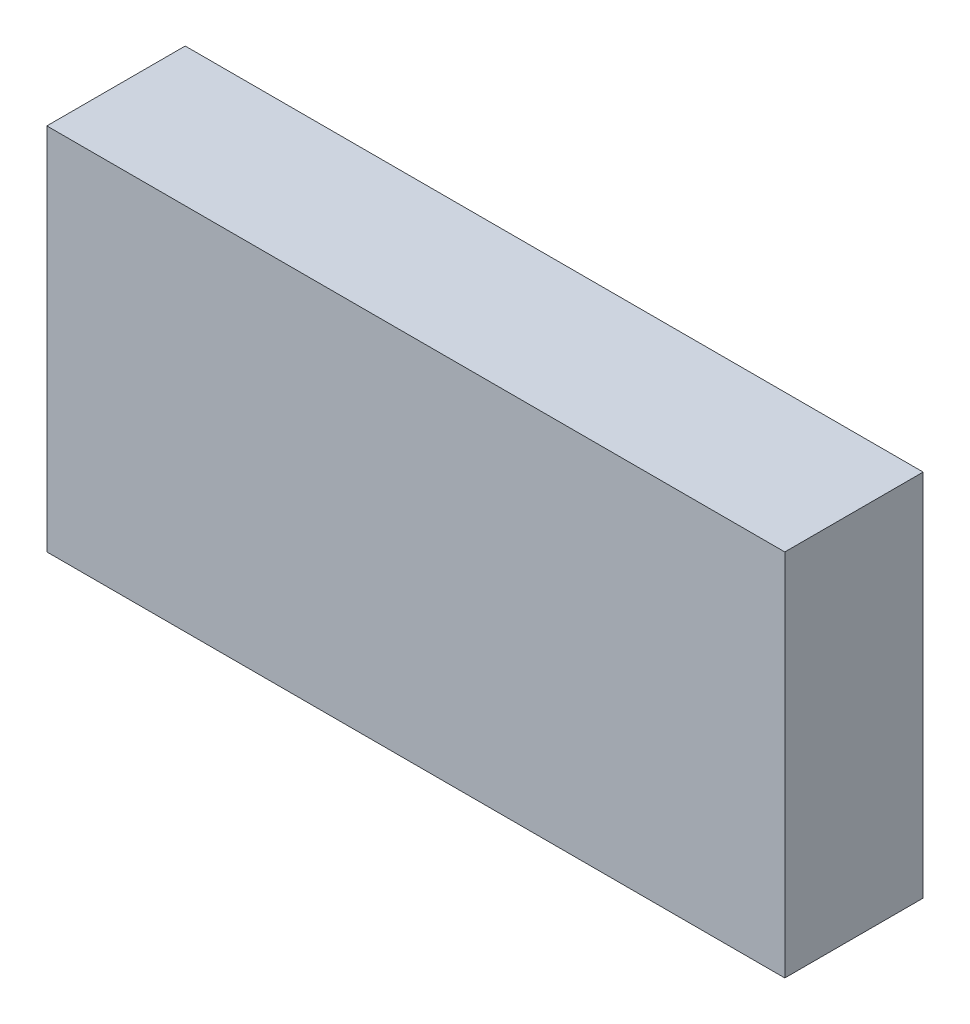
ISO-10303-21;
HEADER;
FILE_DESCRIPTION(('STEP AP214'),'2;1');
FILE_NAME('part.step','',(''),(''),'','','');
FILE_SCHEMA(('AUTOMOTIVE_DESIGN { 1 0 10303 214 1 1 1 1 }'));
ENDSEC;
DATA;
#1=APPLICATION_CONTEXT('core data for automotive mechanical design processes');
#2=APPLICATION_PROTOCOL_DEFINITION('international standard','automotive_design',2000,#1);
#3=PRODUCT_CONTEXT('',#1,'mechanical');
#4=PRODUCT('Part','Part','',(#3));
#5=PRODUCT_RELATED_PRODUCT_CATEGORY('part','',(#4));
#6=PRODUCT_DEFINITION_FORMATION('','',#4);
#7=PRODUCT_DEFINITION_CONTEXT('part definition',#1,'design');
#8=PRODUCT_DEFINITION('design','',#6,#7);
#9=PRODUCT_DEFINITION_SHAPE('','',#8);
#10=(LENGTH_UNIT() NAMED_UNIT(*) SI_UNIT(.MILLI.,.METRE.));
#11=(NAMED_UNIT(*) PLANE_ANGLE_UNIT() SI_UNIT($,.RADIAN.));
#12=(NAMED_UNIT(*) SI_UNIT($,.STERADIAN.) SOLID_ANGLE_UNIT());
#13=UNCERTAINTY_MEASURE_WITH_UNIT(LENGTH_MEASURE(1.E-05),#10,'distance_accuracy_value','');
#14=(GEOMETRIC_REPRESENTATION_CONTEXT(3) GLOBAL_UNCERTAINTY_ASSIGNED_CONTEXT((#13)) GLOBAL_UNIT_ASSIGNED_CONTEXT((#10,
#11,#12)) REPRESENTATION_CONTEXT('',''));
#15=CARTESIAN_POINT('',(0.,0.,0.));
#16=DIRECTION('',(0.,0.,1.));
#17=DIRECTION('',(1.,0.,0.));
#18=AXIS2_PLACEMENT_3D('',#15,#16,#17);
#19=CARTESIAN_POINT('',(40.,-20.,15.));
#20=DIRECTION('',(-1.,0.,0.));
#21=DIRECTION('',(0.,0.,1.));
#22=AXIS2_PLACEMENT_3D('',#19,#20,#21);
#23=PLANE('',#22);
#24=DIRECTION('',(0.,1.,0.));
#25=VECTOR('',#24,1.);
#26=CARTESIAN_POINT('',(40.,-20.,0.));
#27=LINE('',#26,#25);
#28=CARTESIAN_POINT('',(40.,-20.,0.));
#29=VERTEX_POINT('',#28);
#30=CARTESIAN_POINT('',(40.,20.,0.));
#31=VERTEX_POINT('',#30);
#32=EDGE_CURVE('E95',#29,#31,#27,.T.);
#33=ORIENTED_EDGE('',*,*,#32,.T.);
#34=DIRECTION('',(0.,0.,-1.));
#35=VECTOR('',#34,1.);
#36=CARTESIAN_POINT('',(40.,20.,15.));
#37=LINE('',#36,#35);
#38=CARTESIAN_POINT('',(40.,20.,15.));
#39=VERTEX_POINT('',#38);
#40=EDGE_CURVE('E11',#39,#31,#37,.T.);
#41=ORIENTED_EDGE('',*,*,#40,.F.);
#42=DIRECTION('',(0.,1.,0.));
#43=VECTOR('',#42,1.);
#44=CARTESIAN_POINT('',(40.,-20.,15.));
#45=LINE('',#44,#43);
#46=CARTESIAN_POINT('',(40.,-20.,15.));
#47=VERTEX_POINT('',#46);
#48=EDGE_CURVE('E83',#47,#39,#45,.T.);
#49=ORIENTED_EDGE('',*,*,#48,.F.);
#50=DIRECTION('',(0.,0.,-1.));
#51=VECTOR('',#50,1.);
#52=CARTESIAN_POINT('',(40.,-20.,15.));
#53=LINE('',#52,#51);
#54=EDGE_CURVE('E91',#47,#29,#53,.T.);
#55=ORIENTED_EDGE('',*,*,#54,.T.);
#56=EDGE_LOOP('',(#33,#41,#49,#55));
#57=FACE_BOUND('',#56,.T.);
#58=ADVANCED_FACE('F32',(#57),#23,.F.);
#59=CARTESIAN_POINT('',(-40.,20.,15.));
#60=DIRECTION('',(0.,-1.,0.));
#61=DIRECTION('',(0.,0.,-1.));
#62=AXIS2_PLACEMENT_3D('',#59,#60,#61);
#63=PLANE('',#62);
#64=DIRECTION('',(-1.,0.,0.));
#65=VECTOR('',#64,1.);
#66=CARTESIAN_POINT('',(-40.,20.,0.));
#67=LINE('',#66,#65);
#68=CARTESIAN_POINT('',(-40.,20.,0.));
#69=VERTEX_POINT('',#68);
#70=EDGE_CURVE('E87',#31,#69,#67,.T.);
#71=ORIENTED_EDGE('',*,*,#70,.T.);
#72=DIRECTION('',(0.,0.,-1.));
#73=VECTOR('',#72,1.);
#74=CARTESIAN_POINT('',(-40.,20.,15.));
#75=LINE('',#74,#73);
#76=CARTESIAN_POINT('',(-40.,20.,15.));
#77=VERTEX_POINT('',#76);
#78=EDGE_CURVE('E40',#77,#69,#75,.T.);
#79=ORIENTED_EDGE('',*,*,#78,.F.);
#80=DIRECTION('',(-1.,0.,0.));
#81=VECTOR('',#80,1.);
#82=CARTESIAN_POINT('',(-40.,20.,15.));
#83=LINE('',#82,#81);
#84=EDGE_CURVE('E78',#39,#77,#83,.T.);
#85=ORIENTED_EDGE('',*,*,#84,.F.);
#86=ORIENTED_EDGE('',*,*,#40,.T.);
#87=EDGE_LOOP('',(#71,#79,#85,#86));
#88=FACE_BOUND('',#87,.T.);
#89=ADVANCED_FACE('F86',(#88),#63,.F.);
#90=CARTESIAN_POINT('',(-40.,-20.,15.));
#91=DIRECTION('',(1.,0.,0.));
#92=DIRECTION('',(0.,0.,-1.));
#93=AXIS2_PLACEMENT_3D('',#90,#91,#92);
#94=PLANE('',#93);
#95=DIRECTION('',(0.,-1.,0.));
#96=VECTOR('',#95,1.);
#97=CARTESIAN_POINT('',(-40.,-20.,0.));
#98=LINE('',#97,#96);
#99=CARTESIAN_POINT('',(-40.,-20.,0.));
#100=VERTEX_POINT('',#99);
#101=EDGE_CURVE('E65',#69,#100,#98,.T.);
#102=ORIENTED_EDGE('',*,*,#101,.T.);
#103=DIRECTION('',(0.,0.,-1.));
#104=VECTOR('',#103,1.);
#105=CARTESIAN_POINT('',(-40.,-20.,15.));
#106=LINE('',#105,#104);
#107=CARTESIAN_POINT('',(-40.,-20.,15.));
#108=VERTEX_POINT('',#107);
#109=EDGE_CURVE('E88',#108,#100,#106,.T.);
#110=ORIENTED_EDGE('',*,*,#109,.F.);
#111=DIRECTION('',(0.,-1.,0.));
#112=VECTOR('',#111,1.);
#113=CARTESIAN_POINT('',(-40.,-20.,15.));
#114=LINE('',#113,#112);
#115=EDGE_CURVE('E81',#77,#108,#114,.T.);
#116=ORIENTED_EDGE('',*,*,#115,.F.);
#117=ORIENTED_EDGE('',*,*,#78,.T.);
#118=EDGE_LOOP('',(#102,#110,#116,#117));
#119=FACE_BOUND('',#118,.T.);
#120=ADVANCED_FACE('F89',(#119),#94,.F.);
#121=CARTESIAN_POINT('',(-40.,-20.,15.));
#122=DIRECTION('',(0.,1.,0.));
#123=DIRECTION('',(0.,0.,1.));
#124=AXIS2_PLACEMENT_3D('',#121,#122,#123);
#125=PLANE('',#124);
#126=DIRECTION('',(1.,0.,0.));
#127=VECTOR('',#126,1.);
#128=CARTESIAN_POINT('',(-40.,-20.,0.));
#129=LINE('',#128,#127);
#130=EDGE_CURVE('E71',#100,#29,#129,.T.);
#131=ORIENTED_EDGE('',*,*,#130,.T.);
#132=ORIENTED_EDGE('',*,*,#54,.F.);
#133=DIRECTION('',(1.,0.,0.));
#134=VECTOR('',#133,1.);
#135=CARTESIAN_POINT('',(-40.,-20.,15.));
#136=LINE('',#135,#134);
#137=EDGE_CURVE('E48',#108,#47,#136,.T.);
#138=ORIENTED_EDGE('',*,*,#137,.F.);
#139=ORIENTED_EDGE('',*,*,#109,.T.);
#140=EDGE_LOOP('',(#131,#132,#138,#139));
#141=FACE_BOUND('',#140,.T.);
#142=ADVANCED_FACE('F102',(#141),#125,.F.);
#143=CARTESIAN_POINT('',(0.,0.,15.));
#144=DIRECTION('',(0.,0.,-1.));
#145=DIRECTION('',(-1.,0.,0.));
#146=AXIS2_PLACEMENT_3D('',#143,#144,#145);
#147=PLANE('',#146);
#148=ORIENTED_EDGE('',*,*,#48,.T.);
#149=ORIENTED_EDGE('',*,*,#84,.T.);
#150=ORIENTED_EDGE('',*,*,#115,.T.);
#151=ORIENTED_EDGE('',*,*,#137,.T.);
#152=EDGE_LOOP('',(#148,#149,#150,#151));
#153=FACE_BOUND('',#152,.T.);
#154=ADVANCED_FACE('F79',(#153),#147,.F.);
#155=CARTESIAN_POINT('',(0.,0.,0.));
#156=DIRECTION('',(0.,0.,-1.));
#157=DIRECTION('',(-1.,0.,0.));
#158=AXIS2_PLACEMENT_3D('',#155,#156,#157);
#159=PLANE('',#158);
#160=ORIENTED_EDGE('',*,*,#32,.F.);
#161=ORIENTED_EDGE('',*,*,#130,.F.);
#162=ORIENTED_EDGE('',*,*,#101,.F.);
#163=ORIENTED_EDGE('',*,*,#70,.F.);
#164=EDGE_LOOP('',(#160,#161,#162,#163));
#165=FACE_BOUND('',#164,.T.);
#166=ADVANCED_FACE('F105',(#165),#159,.T.);
#167=CLOSED_SHELL('',(#58,#89,#120,#142,#154,#166));
#168=MANIFOLD_SOLID_BREP('B2',#167);
#169=ADVANCED_BREP_SHAPE_REPRESENTATION('',(#18,#168),#14);
#170=SHAPE_DEFINITION_REPRESENTATION(#9,#169);
ENDSEC;
END-ISO-10303-21;
